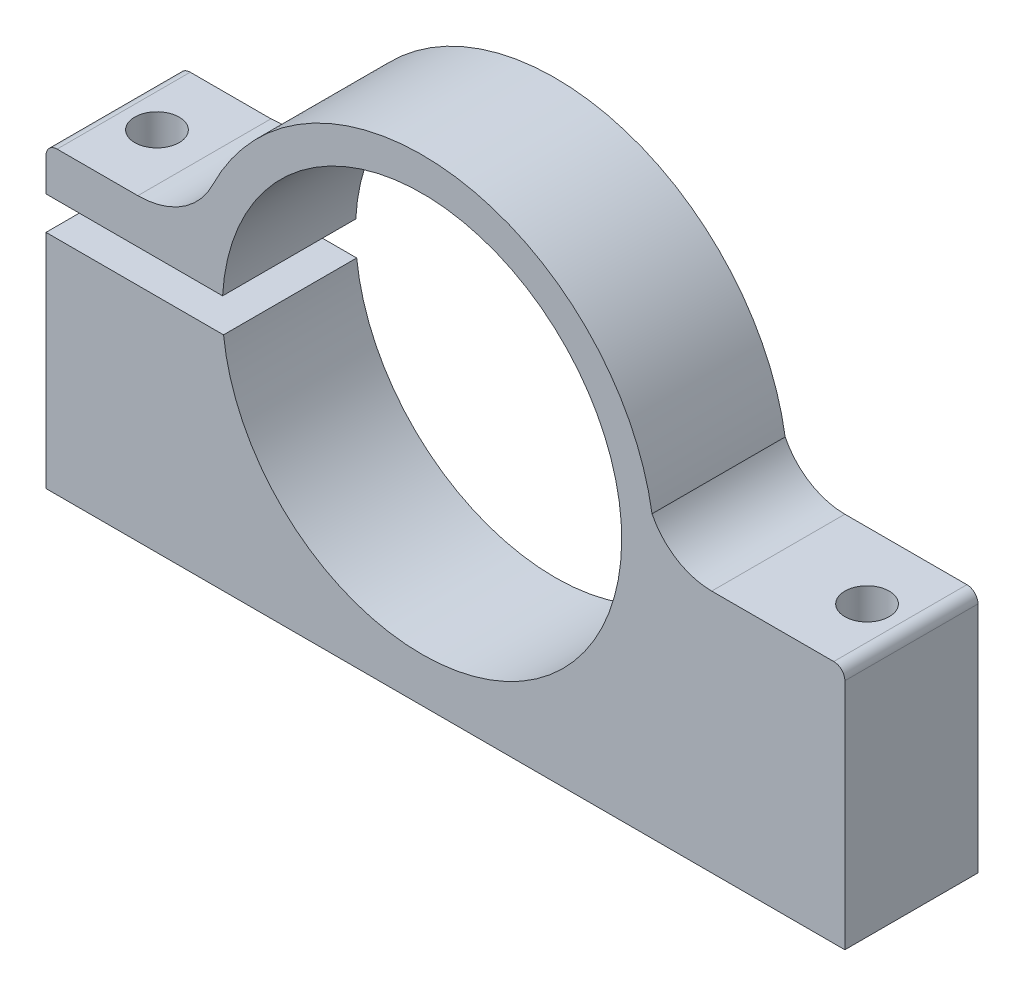
ISO-10303-21;
HEADER;
FILE_DESCRIPTION(('STEP AP214'),'2;1');
FILE_NAME('part.step','',(''),(''),'','','');
FILE_SCHEMA(('AUTOMOTIVE_DESIGN { 1 0 10303 214 1 1 1 1 }'));
ENDSEC;
DATA;
#1=APPLICATION_CONTEXT('core data for automotive mechanical design processes');
#2=APPLICATION_PROTOCOL_DEFINITION('international standard','automotive_design',2000,#1);
#3=PRODUCT_CONTEXT('',#1,'mechanical');
#4=PRODUCT('Part','Part','',(#3));
#5=PRODUCT_RELATED_PRODUCT_CATEGORY('part','',(#4));
#6=PRODUCT_DEFINITION_FORMATION('','',#4);
#7=PRODUCT_DEFINITION_CONTEXT('part definition',#1,'design');
#8=PRODUCT_DEFINITION('design','',#6,#7);
#9=PRODUCT_DEFINITION_SHAPE('','',#8);
#10=(LENGTH_UNIT() NAMED_UNIT(*) SI_UNIT(.MILLI.,.METRE.));
#11=(NAMED_UNIT(*) PLANE_ANGLE_UNIT() SI_UNIT($,.RADIAN.));
#12=(NAMED_UNIT(*) SI_UNIT($,.STERADIAN.) SOLID_ANGLE_UNIT());
#13=UNCERTAINTY_MEASURE_WITH_UNIT(LENGTH_MEASURE(1.E-05),#10,'distance_accuracy_value','');
#14=(GEOMETRIC_REPRESENTATION_CONTEXT(3) GLOBAL_UNCERTAINTY_ASSIGNED_CONTEXT((#13)) GLOBAL_UNIT_ASSIGNED_CONTEXT((#10,
#11,#12)) REPRESENTATION_CONTEXT('',''));
#15=CARTESIAN_POINT('',(0.,0.,0.));
#16=DIRECTION('',(0.,0.,1.));
#17=DIRECTION('',(1.,0.,0.));
#18=AXIS2_PLACEMENT_3D('',#15,#16,#17);
#19=CARTESIAN_POINT('',(0.,0.,-12.));
#20=DIRECTION('',(-1.,0.,0.));
#21=DIRECTION('',(0.,0.,-1.));
#22=AXIS2_PLACEMENT_3D('',#19,#20,#21);
#23=PLANE('',#22);
#24=DIRECTION('',(0.,1.,0.));
#25=VECTOR('',#24,1.);
#26=CARTESIAN_POINT('',(0.,0.,0.));
#27=LINE('',#26,#25);
#28=CARTESIAN_POINT('',(0.,0.,0.));
#29=VERTEX_POINT('',#28);
#30=CARTESIAN_POINT('',(0.,20.,0.));
#31=VERTEX_POINT('',#30);
#32=EDGE_CURVE('E156',#29,#31,#27,.T.);
#33=ORIENTED_EDGE('',*,*,#32,.T.);
#34=DIRECTION('',(0.,0.,1.));
#35=VECTOR('',#34,1.);
#36=CARTESIAN_POINT('',(0.,20.,-12.));
#37=LINE('',#36,#35);
#38=CARTESIAN_POINT('',(0.,20.,-12.));
#39=VERTEX_POINT('',#38);
#40=EDGE_CURVE('E138',#39,#31,#37,.T.);
#41=ORIENTED_EDGE('',*,*,#40,.F.);
#42=DIRECTION('',(0.,1.,0.));
#43=VECTOR('',#42,1.);
#44=CARTESIAN_POINT('',(0.,0.,-12.));
#45=LINE('',#44,#43);
#46=CARTESIAN_POINT('',(0.,0.,-12.));
#47=VERTEX_POINT('',#46);
#48=EDGE_CURVE('E144',#47,#39,#45,.T.);
#49=ORIENTED_EDGE('',*,*,#48,.F.);
#50=DIRECTION('',(0.,0.,1.));
#51=VECTOR('',#50,1.);
#52=CARTESIAN_POINT('',(0.,0.,-12.));
#53=LINE('',#52,#51);
#54=EDGE_CURVE('E177',#47,#29,#53,.T.);
#55=ORIENTED_EDGE('',*,*,#54,.T.);
#56=EDGE_LOOP('',(#33,#41,#49,#55));
#57=FACE_BOUND('',#56,.T.);
#58=ADVANCED_FACE('F35',(#57),#23,.T.);
#59=CARTESIAN_POINT('',(0.,0.,-12.));
#60=DIRECTION('',(0.,1.,0.));
#61=DIRECTION('',(0.,0.,-1.));
#62=AXIS2_PLACEMENT_3D('',#59,#60,#61);
#63=PLANE('',#62);
#64=CARTESIAN_POINT('',(68.,0.,-6.));
#65=DIRECTION('',(0.,1.,0.));
#66=DIRECTION('',(0.,0.,1.));
#67=AXIS2_PLACEMENT_3D('',#64,#65,#66);
#68=CIRCLE('',#67,2.);
#69=CARTESIAN_POINT('',(68.,0.,-4.));
#70=VERTEX_POINT('',#69);
#71=EDGE_CURVE('E172',#70,#70,#68,.T.);
#72=ORIENTED_EDGE('',*,*,#71,.T.);
#73=EDGE_LOOP('',(#72));
#74=FACE_BOUND('',#73,.T.);
#75=CARTESIAN_POINT('',(4.,0.,-6.));
#76=DIRECTION('',(0.,1.,0.));
#77=DIRECTION('',(0.,0.,1.));
#78=AXIS2_PLACEMENT_3D('',#75,#76,#77);
#79=CIRCLE('',#78,2.);
#80=CARTESIAN_POINT('',(4.,0.,-4.));
#81=VERTEX_POINT('',#80);
#82=EDGE_CURVE('E168',#81,#81,#79,.T.);
#83=ORIENTED_EDGE('',*,*,#82,.T.);
#84=EDGE_LOOP('',(#83));
#85=FACE_BOUND('',#84,.T.);
#86=DIRECTION('',(1.,0.,0.));
#87=VECTOR('',#86,1.);
#88=CARTESIAN_POINT('',(0.,0.,0.));
#89=LINE('',#88,#87);
#90=CARTESIAN_POINT('',(72.,0.,0.));
#91=VERTEX_POINT('',#90);
#92=EDGE_CURVE('E153',#29,#91,#89,.T.);
#93=ORIENTED_EDGE('',*,*,#92,.F.);
#94=ORIENTED_EDGE('',*,*,#54,.F.);
#95=DIRECTION('',(1.,0.,0.));
#96=VECTOR('',#95,1.);
#97=CARTESIAN_POINT('',(0.,0.,-12.));
#98=LINE('',#97,#96);
#99=CARTESIAN_POINT('',(72.,0.,-12.));
#100=VERTEX_POINT('',#99);
#101=EDGE_CURVE('E149',#47,#100,#98,.T.);
#102=ORIENTED_EDGE('',*,*,#101,.T.);
#103=DIRECTION('',(0.,0.,1.));
#104=VECTOR('',#103,1.);
#105=CARTESIAN_POINT('',(72.,0.,-12.));
#106=LINE('',#105,#104);
#107=EDGE_CURVE('E210',#100,#91,#106,.T.);
#108=ORIENTED_EDGE('',*,*,#107,.T.);
#109=EDGE_LOOP('',(#93,#94,#102,#108));
#110=FACE_BOUND('',#109,.T.);
#111=ADVANCED_FACE('F306',(#74,#85,#110),#63,.F.);
#112=CARTESIAN_POINT('',(72.,0.,-12.));
#113=DIRECTION('',(-1.,0.,0.));
#114=DIRECTION('',(0.,0.,-1.));
#115=AXIS2_PLACEMENT_3D('',#112,#113,#114);
#116=PLANE('',#115);
#117=DIRECTION('',(0.,1.,0.));
#118=VECTOR('',#117,1.);
#119=CARTESIAN_POINT('',(72.,0.,0.));
#120=LINE('',#119,#118);
#121=CARTESIAN_POINT('',(72.,21.,0.));
#122=VERTEX_POINT('',#121);
#123=EDGE_CURVE('E198',#91,#122,#120,.T.);
#124=ORIENTED_EDGE('',*,*,#123,.F.);
#125=ORIENTED_EDGE('',*,*,#107,.F.);
#126=DIRECTION('',(0.,1.,0.));
#127=VECTOR('',#126,1.);
#128=CARTESIAN_POINT('',(72.,0.,-12.));
#129=LINE('',#128,#127);
#130=CARTESIAN_POINT('',(72.,21.,-12.));
#131=VERTEX_POINT('',#130);
#132=EDGE_CURVE('E160',#100,#131,#129,.T.);
#133=ORIENTED_EDGE('',*,*,#132,.T.);
#134=DIRECTION('',(0.,0.,1.));
#135=VECTOR('',#134,1.);
#136=CARTESIAN_POINT('',(72.,21.,-12.));
#137=LINE('',#136,#135);
#138=EDGE_CURVE('E11',#122,#131,#137,.F.);
#139=ORIENTED_EDGE('',*,*,#138,.F.);
#140=EDGE_LOOP('',(#124,#125,#133,#139));
#141=FACE_BOUND('',#140,.T.);
#142=ADVANCED_FACE('F311',(#141),#116,.F.);
#143=CARTESIAN_POINT('',(72.,22.,-12.));
#144=DIRECTION('',(0.,-1.,0.));
#145=DIRECTION('',(0.,0.,1.));
#146=AXIS2_PLACEMENT_3D('',#143,#144,#145);
#147=PLANE('',#146);
#148=CARTESIAN_POINT('',(68.,22.,-6.));
#149=DIRECTION('',(0.,1.,0.));
#150=DIRECTION('',(0.,0.,1.));
#151=AXIS2_PLACEMENT_3D('',#148,#149,#150);
#152=CIRCLE('',#151,2.);
#153=CARTESIAN_POINT('',(68.,22.,-4.));
#154=VERTEX_POINT('',#153);
#155=EDGE_CURVE('E169',#154,#154,#152,.T.);
#156=ORIENTED_EDGE('',*,*,#155,.F.);
#157=EDGE_LOOP('',(#156));
#158=FACE_BOUND('',#157,.T.);
#159=DIRECTION('',(-1.,0.,0.));
#160=VECTOR('',#159,1.);
#161=CARTESIAN_POINT('',(72.,22.,-12.));
#162=LINE('',#161,#160);
#163=CARTESIAN_POINT('',(71.,22.,-12.));
#164=VERTEX_POINT('',#163);
#165=CARTESIAN_POINT('',(60.,22.,-12.));
#166=VERTEX_POINT('',#165);
#167=EDGE_CURVE('E261',#164,#166,#162,.T.);
#168=ORIENTED_EDGE('',*,*,#167,.T.);
#169=DIRECTION('',(0.,0.,1.));
#170=VECTOR('',#169,1.);
#171=CARTESIAN_POINT('',(60.,22.,-12.));
#172=LINE('',#171,#170);
#173=CARTESIAN_POINT('',(60.,22.,0.));
#174=VERTEX_POINT('',#173);
#175=EDGE_CURVE('E195',#166,#174,#172,.T.);
#176=ORIENTED_EDGE('',*,*,#175,.T.);
#177=DIRECTION('',(-1.,0.,0.));
#178=VECTOR('',#177,1.);
#179=CARTESIAN_POINT('',(72.,22.,0.));
#180=LINE('',#179,#178);
#181=CARTESIAN_POINT('',(71.,22.,0.));
#182=VERTEX_POINT('',#181);
#183=EDGE_CURVE('E192',#182,#174,#180,.T.);
#184=ORIENTED_EDGE('',*,*,#183,.F.);
#185=DIRECTION('',(0.,0.,1.));
#186=VECTOR('',#185,1.);
#187=CARTESIAN_POINT('',(71.,22.,-12.));
#188=LINE('',#187,#186);
#189=EDGE_CURVE('E43',#164,#182,#188,.T.);
#190=ORIENTED_EDGE('',*,*,#189,.F.);
#191=EDGE_LOOP('',(#168,#176,#184,#190));
#192=FACE_BOUND('',#191,.T.);
#193=ADVANCED_FACE('F193',(#158,#192),#147,.F.);
#194=CARTESIAN_POINT('',(60.,28.,-12.));
#195=DIRECTION('',(0.,0.,1.));
#196=DIRECTION('',(-1.,0.,0.));
#197=AXIS2_PLACEMENT_3D('',#194,#195,#196);
#198=CYLINDRICAL_SURFACE('',#197,6.);
#199=CARTESIAN_POINT('',(60.,28.,0.));
#200=DIRECTION('',(0.,0.,-1.));
#201=DIRECTION('',(-1.,0.,0.));
#202=AXIS2_PLACEMENT_3D('',#199,#200,#201);
#203=CIRCLE('',#202,6.);
#204=CARTESIAN_POINT('',(54.6209302283055,25.3418787854496,0.));
#205=VERTEX_POINT('',#204);
#206=EDGE_CURVE('E199',#174,#205,#203,.T.);
#207=ORIENTED_EDGE('',*,*,#206,.F.);
#208=ORIENTED_EDGE('',*,*,#175,.F.);
#209=CARTESIAN_POINT('',(60.,28.,-12.));
#210=DIRECTION('',(0.,0.,-1.));
#211=DIRECTION('',(-1.,0.,0.));
#212=AXIS2_PLACEMENT_3D('',#209,#210,#211);
#213=CIRCLE('',#212,6.);
#214=CARTESIAN_POINT('',(54.6209302283055,25.3418787854496,-12.));
#215=VERTEX_POINT('',#214);
#216=EDGE_CURVE('E260',#166,#215,#213,.T.);
#217=ORIENTED_EDGE('',*,*,#216,.T.);
#218=DIRECTION('',(0.,0.,1.));
#219=VECTOR('',#218,1.);
#220=CARTESIAN_POINT('',(54.6209302283055,25.3418787854496,-12.));
#221=LINE('',#220,#219);
#222=EDGE_CURVE('E214',#215,#205,#221,.T.);
#223=ORIENTED_EDGE('',*,*,#222,.T.);
#224=EDGE_LOOP('',(#207,#208,#217,#223));
#225=FACE_BOUND('',#224,.T.);
#226=ADVANCED_FACE('F259',(#225),#198,.F.);
#227=CARTESIAN_POINT('',(33.8885438199983,22.,-12.));
#228=DIRECTION('',(0.,0.,1.));
#229=DIRECTION('',(-1.,0.,0.));
#230=AXIS2_PLACEMENT_3D('',#227,#228,#229);
#231=CYLINDRICAL_SURFACE('',#230,21.);
#232=CARTESIAN_POINT('',(33.8885438199983,22.,0.));
#233=DIRECTION('',(0.,0.,-1.));
#234=DIRECTION('',(-1.,0.,0.));
#235=AXIS2_PLACEMENT_3D('',#232,#233,#234);
#236=CIRCLE('',#235,21.);
#237=CARTESIAN_POINT('',(15.016177646512,31.2105263157895,0.));
#238=VERTEX_POINT('',#237);
#239=EDGE_CURVE('E203',#238,#205,#236,.T.);
#240=ORIENTED_EDGE('',*,*,#239,.T.);
#241=ORIENTED_EDGE('',*,*,#222,.F.);
#242=CARTESIAN_POINT('',(33.8885438199983,22.,-12.));
#243=DIRECTION('',(0.,0.,-1.));
#244=DIRECTION('',(-1.,0.,0.));
#245=AXIS2_PLACEMENT_3D('',#242,#243,#244);
#246=CIRCLE('',#245,21.);
#247=CARTESIAN_POINT('',(15.016177646512,31.2105263157895,-12.));
#248=VERTEX_POINT('',#247);
#249=EDGE_CURVE('E262',#248,#215,#246,.T.);
#250=ORIENTED_EDGE('',*,*,#249,.F.);
#251=DIRECTION('',(0.,0.,1.));
#252=VECTOR('',#251,1.);
#253=CARTESIAN_POINT('',(15.016177646512,31.2105263157895,-12.));
#254=LINE('',#253,#252);
#255=EDGE_CURVE('E217',#248,#238,#254,.T.);
#256=ORIENTED_EDGE('',*,*,#255,.T.);
#257=EDGE_LOOP('',(#240,#241,#250,#256));
#258=FACE_BOUND('',#257,.T.);
#259=ADVANCED_FACE('F253',(#258),#231,.T.);
#260=CARTESIAN_POINT('',(8.27604687026692,34.5,-12.));
#261=DIRECTION('',(0.,0.,1.));
#262=DIRECTION('',(-1.,0.,0.));
#263=AXIS2_PLACEMENT_3D('',#260,#261,#262);
#264=CYLINDRICAL_SURFACE('',#263,7.5);
#265=CARTESIAN_POINT('',(8.27604687026692,34.5,0.));
#266=DIRECTION('',(0.,0.,1.));
#267=DIRECTION('',(1.,0.,0.));
#268=AXIS2_PLACEMENT_3D('',#265,#266,#267);
#269=CIRCLE('',#268,7.5);
#270=CARTESIAN_POINT('',(8.27604687026692,27.,0.));
#271=VERTEX_POINT('',#270);
#272=EDGE_CURVE('E249',#271,#238,#269,.T.);
#273=ORIENTED_EDGE('',*,*,#272,.T.);
#274=ORIENTED_EDGE('',*,*,#255,.F.);
#275=CARTESIAN_POINT('',(8.27604687026692,34.5,-12.));
#276=DIRECTION('',(0.,0.,1.));
#277=DIRECTION('',(1.,0.,0.));
#278=AXIS2_PLACEMENT_3D('',#275,#276,#277);
#279=CIRCLE('',#278,7.5);
#280=CARTESIAN_POINT('',(8.27604687026692,27.,-12.));
#281=VERTEX_POINT('',#280);
#282=EDGE_CURVE('E265',#281,#248,#279,.T.);
#283=ORIENTED_EDGE('',*,*,#282,.F.);
#284=DIRECTION('',(0.,0.,1.));
#285=VECTOR('',#284,1.);
#286=CARTESIAN_POINT('',(8.27604687026692,27.,-12.));
#287=LINE('',#286,#285);
#288=EDGE_CURVE('E220',#281,#271,#287,.T.);
#289=ORIENTED_EDGE('',*,*,#288,.T.);
#290=EDGE_LOOP('',(#273,#274,#283,#289));
#291=FACE_BOUND('',#290,.T.);
#292=ADVANCED_FACE('F284',(#291),#264,.F.);
#293=CARTESIAN_POINT('',(0.,27.,-12.));
#294=DIRECTION('',(0.,1.,0.));
#295=DIRECTION('',(0.,0.,-1.));
#296=AXIS2_PLACEMENT_3D('',#293,#294,#295);
#297=PLANE('',#296);
#298=CARTESIAN_POINT('',(4.,27.,-6.));
#299=DIRECTION('',(0.,-1.,0.));
#300=DIRECTION('',(0.,0.,-1.));
#301=AXIS2_PLACEMENT_3D('',#298,#299,#300);
#302=CIRCLE('',#301,2.);
#303=CARTESIAN_POINT('',(4.,27.,-8.));
#304=VERTEX_POINT('',#303);
#305=EDGE_CURVE('E271',#304,#304,#302,.T.);
#306=ORIENTED_EDGE('',*,*,#305,.T.);
#307=EDGE_LOOP('',(#306));
#308=FACE_BOUND('',#307,.T.);
#309=DIRECTION('',(1.,0.,0.));
#310=VECTOR('',#309,1.);
#311=CARTESIAN_POINT('',(0.,27.,0.));
#312=LINE('',#311,#310);
#313=CARTESIAN_POINT('',(1.,27.,0.));
#314=VERTEX_POINT('',#313);
#315=EDGE_CURVE('E242',#314,#271,#312,.T.);
#316=ORIENTED_EDGE('',*,*,#315,.T.);
#317=ORIENTED_EDGE('',*,*,#288,.F.);
#318=DIRECTION('',(1.,0.,0.));
#319=VECTOR('',#318,1.);
#320=CARTESIAN_POINT('',(0.,27.,-12.));
#321=LINE('',#320,#319);
#322=CARTESIAN_POINT('',(1.,27.,-12.));
#323=VERTEX_POINT('',#322);
#324=EDGE_CURVE('E279',#323,#281,#321,.T.);
#325=ORIENTED_EDGE('',*,*,#324,.F.);
#326=DIRECTION('',(0.,0.,1.));
#327=VECTOR('',#326,1.);
#328=CARTESIAN_POINT('',(1.,27.,-12.));
#329=LINE('',#328,#327);
#330=EDGE_CURVE('E181',#314,#323,#329,.F.);
#331=ORIENTED_EDGE('',*,*,#330,.F.);
#332=EDGE_LOOP('',(#316,#317,#325,#331));
#333=FACE_BOUND('',#332,.T.);
#334=ADVANCED_FACE('F288',(#308,#333),#297,.T.);
#335=CARTESIAN_POINT('',(0.,23.,-12.));
#336=DIRECTION('',(-1.,0.,0.));
#337=DIRECTION('',(0.,-1.,0.));
#338=AXIS2_PLACEMENT_3D('',#335,#336,#337);
#339=PLANE('',#338);
#340=DIRECTION('',(0.,1.,0.));
#341=VECTOR('',#340,1.);
#342=CARTESIAN_POINT('',(0.,23.,-12.));
#343=LINE('',#342,#341);
#344=CARTESIAN_POINT('',(0.,23.,-12.));
#345=VERTEX_POINT('',#344);
#346=CARTESIAN_POINT('',(0.,26.,-12.));
#347=VERTEX_POINT('',#346);
#348=EDGE_CURVE('E274',#345,#347,#343,.T.);
#349=ORIENTED_EDGE('',*,*,#348,.F.);
#350=DIRECTION('',(0.,0.,1.));
#351=VECTOR('',#350,1.);
#352=CARTESIAN_POINT('',(0.,23.,-12.));
#353=LINE('',#352,#351);
#354=CARTESIAN_POINT('',(0.,23.,0.));
#355=VERTEX_POINT('',#354);
#356=EDGE_CURVE('E223',#345,#355,#353,.T.);
#357=ORIENTED_EDGE('',*,*,#356,.T.);
#358=DIRECTION('',(0.,1.,0.));
#359=VECTOR('',#358,1.);
#360=CARTESIAN_POINT('',(0.,23.,0.));
#361=LINE('',#360,#359);
#362=CARTESIAN_POINT('',(0.,26.,0.));
#363=VERTEX_POINT('',#362);
#364=EDGE_CURVE('E240',#355,#363,#361,.T.);
#365=ORIENTED_EDGE('',*,*,#364,.T.);
#366=DIRECTION('',(0.,0.,1.));
#367=VECTOR('',#366,1.);
#368=CARTESIAN_POINT('',(0.,26.,-12.));
#369=LINE('',#368,#367);
#370=EDGE_CURVE('E173',#347,#363,#369,.T.);
#371=ORIENTED_EDGE('',*,*,#370,.F.);
#372=EDGE_LOOP('',(#349,#357,#365,#371));
#373=FACE_BOUND('',#372,.T.);
#374=ADVANCED_FACE('F294',(#373),#339,.T.);
#375=CARTESIAN_POINT('',(15.9163430643869,23.,-12.));
#376=DIRECTION('',(0.,-1.,0.));
#377=DIRECTION('',(1.,0.,0.));
#378=AXIS2_PLACEMENT_3D('',#375,#376,#377);
#379=PLANE('',#378);
#380=CARTESIAN_POINT('',(4.,23.,-6.));
#381=DIRECTION('',(0.,1.,0.));
#382=DIRECTION('',(1.,0.,0.));
#383=AXIS2_PLACEMENT_3D('',#380,#381,#382);
#384=CIRCLE('',#383,2.);
#385=CARTESIAN_POINT('',(6.,23.,-6.));
#386=VERTEX_POINT('',#385);
#387=EDGE_CURVE('E167',#386,#386,#384,.T.);
#388=ORIENTED_EDGE('',*,*,#387,.T.);
#389=EDGE_LOOP('',(#388));
#390=FACE_BOUND('',#389,.T.);
#391=DIRECTION('',(-1.,0.,0.));
#392=VECTOR('',#391,1.);
#393=CARTESIAN_POINT('',(15.9163430643869,23.,0.));
#394=LINE('',#393,#392);
#395=CARTESIAN_POINT('',(15.9163430643869,23.,0.));
#396=VERTEX_POINT('',#395);
#397=EDGE_CURVE('E232',#396,#355,#394,.T.);
#398=ORIENTED_EDGE('',*,*,#397,.T.);
#399=ORIENTED_EDGE('',*,*,#356,.F.);
#400=DIRECTION('',(-1.,0.,0.));
#401=VECTOR('',#400,1.);
#402=CARTESIAN_POINT('',(15.9163430643869,23.,-12.));
#403=LINE('',#402,#401);
#404=CARTESIAN_POINT('',(15.9163430643869,23.,-12.));
#405=VERTEX_POINT('',#404);
#406=EDGE_CURVE('E234',#405,#345,#403,.T.);
#407=ORIENTED_EDGE('',*,*,#406,.F.);
#408=DIRECTION('',(0.,0.,1.));
#409=VECTOR('',#408,1.);
#410=CARTESIAN_POINT('',(15.9163430643869,23.,-12.));
#411=LINE('',#410,#409);
#412=EDGE_CURVE('E158',#405,#396,#411,.T.);
#413=ORIENTED_EDGE('',*,*,#412,.T.);
#414=EDGE_LOOP('',(#398,#399,#407,#413));
#415=FACE_BOUND('',#414,.T.);
#416=ADVANCED_FACE('F230',(#390,#415),#379,.T.);
#417=CARTESIAN_POINT('',(33.8885438199983,22.,-12.));
#418=DIRECTION('',(0.,0.,1.));
#419=DIRECTION('',(-1.,0.,0.));
#420=AXIS2_PLACEMENT_3D('',#417,#418,#419);
#421=CYLINDRICAL_SURFACE('',#420,18.);
#422=CARTESIAN_POINT('',(33.8885438199983,22.,0.));
#423=DIRECTION('',(0.,0.,1.));
#424=DIRECTION('',(1.,0.,0.));
#425=AXIS2_PLACEMENT_3D('',#422,#423,#424);
#426=CIRCLE('',#425,18.);
#427=CARTESIAN_POINT('',(16.,20.,0.));
#428=VERTEX_POINT('',#427);
#429=EDGE_CURVE('E238',#428,#396,#426,.T.);
#430=ORIENTED_EDGE('',*,*,#429,.T.);
#431=ORIENTED_EDGE('',*,*,#412,.F.);
#432=CARTESIAN_POINT('',(33.8885438199983,22.,-12.));
#433=DIRECTION('',(0.,0.,1.));
#434=DIRECTION('',(1.,0.,0.));
#435=AXIS2_PLACEMENT_3D('',#432,#433,#434);
#436=CIRCLE('',#435,18.);
#437=CARTESIAN_POINT('',(16.,20.,-12.));
#438=VERTEX_POINT('',#437);
#439=EDGE_CURVE('E143',#438,#405,#436,.T.);
#440=ORIENTED_EDGE('',*,*,#439,.F.);
#441=DIRECTION('',(0.,0.,1.));
#442=VECTOR('',#441,1.);
#443=CARTESIAN_POINT('',(16.,20.,-12.));
#444=LINE('',#443,#442);
#445=EDGE_CURVE('E141',#438,#428,#444,.T.);
#446=ORIENTED_EDGE('',*,*,#445,.T.);
#447=EDGE_LOOP('',(#430,#431,#440,#446));
#448=FACE_BOUND('',#447,.T.);
#449=ADVANCED_FACE('F272',(#448),#421,.F.);
#450=CARTESIAN_POINT('',(0.,20.,-12.));
#451=DIRECTION('',(0.,1.,0.));
#452=DIRECTION('',(0.,0.,-1.));
#453=AXIS2_PLACEMENT_3D('',#450,#451,#452);
#454=PLANE('',#453);
#455=CARTESIAN_POINT('',(4.,20.,-6.));
#456=DIRECTION('',(0.,-1.,0.));
#457=DIRECTION('',(0.,0.,-1.));
#458=AXIS2_PLACEMENT_3D('',#455,#456,#457);
#459=CIRCLE('',#458,2.);
#460=CARTESIAN_POINT('',(4.,20.,-8.));
#461=VERTEX_POINT('',#460);
#462=EDGE_CURVE('E164',#461,#461,#459,.T.);
#463=ORIENTED_EDGE('',*,*,#462,.T.);
#464=EDGE_LOOP('',(#463));
#465=FACE_BOUND('',#464,.T.);
#466=DIRECTION('',(1.,0.,0.));
#467=VECTOR('',#466,1.);
#468=CARTESIAN_POINT('',(0.,20.,0.));
#469=LINE('',#468,#467);
#470=EDGE_CURVE('E244',#31,#428,#469,.T.);
#471=ORIENTED_EDGE('',*,*,#470,.T.);
#472=ORIENTED_EDGE('',*,*,#445,.F.);
#473=DIRECTION('',(1.,0.,0.));
#474=VECTOR('',#473,1.);
#475=CARTESIAN_POINT('',(0.,20.,-12.));
#476=LINE('',#475,#474);
#477=EDGE_CURVE('E134',#39,#438,#476,.T.);
#478=ORIENTED_EDGE('',*,*,#477,.F.);
#479=ORIENTED_EDGE('',*,*,#40,.T.);
#480=EDGE_LOOP('',(#471,#472,#478,#479));
#481=FACE_BOUND('',#480,.T.);
#482=ADVANCED_FACE('F136',(#465,#481),#454,.T.);
#483=CARTESIAN_POINT('',(33.8885438199983,22.,-12.));
#484=DIRECTION('',(0.,0.,-1.));
#485=DIRECTION('',(1.,0.,0.));
#486=AXIS2_PLACEMENT_3D('',#483,#484,#485);
#487=PLANE('',#486);
#488=ORIENTED_EDGE('',*,*,#324,.T.);
#489=ORIENTED_EDGE('',*,*,#282,.T.);
#490=ORIENTED_EDGE('',*,*,#249,.T.);
#491=ORIENTED_EDGE('',*,*,#216,.F.);
#492=ORIENTED_EDGE('',*,*,#167,.F.);
#493=CARTESIAN_POINT('',(71.,21.,-12.));
#494=DIRECTION('',(0.,0.,1.));
#495=DIRECTION('',(1.,0.,0.));
#496=AXIS2_PLACEMENT_3D('',#493,#494,#495);
#497=CIRCLE('',#496,1.);
#498=EDGE_CURVE('E49',#131,#164,#497,.T.);
#499=ORIENTED_EDGE('',*,*,#498,.F.);
#500=ORIENTED_EDGE('',*,*,#132,.F.);
#501=ORIENTED_EDGE('',*,*,#101,.F.);
#502=ORIENTED_EDGE('',*,*,#48,.T.);
#503=ORIENTED_EDGE('',*,*,#477,.T.);
#504=ORIENTED_EDGE('',*,*,#439,.T.);
#505=ORIENTED_EDGE('',*,*,#406,.T.);
#506=ORIENTED_EDGE('',*,*,#348,.T.);
#507=CARTESIAN_POINT('',(1.,26.,-12.));
#508=DIRECTION('',(0.,0.,1.));
#509=DIRECTION('',(1.,0.,0.));
#510=AXIS2_PLACEMENT_3D('',#507,#508,#509);
#511=CIRCLE('',#510,1.);
#512=EDGE_CURVE('E185',#323,#347,#511,.T.);
#513=ORIENTED_EDGE('',*,*,#512,.F.);
#514=EDGE_LOOP('',(#488,#489,#490,#491,#492,#499,#500,#501,#502,#503,#504,#505,#506,#513));
#515=FACE_BOUND('',#514,.T.);
#516=ADVANCED_FACE('F147',(#515),#487,.T.);
#517=CARTESIAN_POINT('',(33.8885438199983,22.,0.));
#518=DIRECTION('',(0.,0.,-1.));
#519=DIRECTION('',(1.,0.,0.));
#520=AXIS2_PLACEMENT_3D('',#517,#518,#519);
#521=PLANE('',#520);
#522=ORIENTED_EDGE('',*,*,#364,.F.);
#523=ORIENTED_EDGE('',*,*,#397,.F.);
#524=ORIENTED_EDGE('',*,*,#429,.F.);
#525=ORIENTED_EDGE('',*,*,#470,.F.);
#526=ORIENTED_EDGE('',*,*,#32,.F.);
#527=ORIENTED_EDGE('',*,*,#92,.T.);
#528=ORIENTED_EDGE('',*,*,#123,.T.);
#529=CARTESIAN_POINT('',(71.,21.,0.));
#530=DIRECTION('',(0.,0.,1.));
#531=DIRECTION('',(1.,0.,0.));
#532=AXIS2_PLACEMENT_3D('',#529,#530,#531);
#533=CIRCLE('',#532,1.);
#534=EDGE_CURVE('E176',#182,#122,#533,.F.);
#535=ORIENTED_EDGE('',*,*,#534,.F.);
#536=ORIENTED_EDGE('',*,*,#183,.T.);
#537=ORIENTED_EDGE('',*,*,#206,.T.);
#538=ORIENTED_EDGE('',*,*,#239,.F.);
#539=ORIENTED_EDGE('',*,*,#272,.F.);
#540=ORIENTED_EDGE('',*,*,#315,.F.);
#541=CARTESIAN_POINT('',(1.,26.,0.));
#542=DIRECTION('',(0.,0.,1.));
#543=DIRECTION('',(1.,0.,0.));
#544=AXIS2_PLACEMENT_3D('',#541,#542,#543);
#545=CIRCLE('',#544,1.);
#546=EDGE_CURVE('E179',#363,#314,#545,.F.);
#547=ORIENTED_EDGE('',*,*,#546,.F.);
#548=EDGE_LOOP('',(#522,#523,#524,#525,#526,#527,#528,#535,#536,#537,#538,#539,#540,#547));
#549=FACE_BOUND('',#548,.T.);
#550=ADVANCED_FACE('F237',(#549),#521,.F.);
#551=CARTESIAN_POINT('',(4.,43.,-6.));
#552=DIRECTION('',(0.,-1.,0.));
#553=DIRECTION('',(0.,0.,1.));
#554=AXIS2_PLACEMENT_3D('',#551,#552,#553);
#555=CYLINDRICAL_SURFACE('',#554,2.);
#556=ORIENTED_EDGE('',*,*,#462,.F.);
#557=EDGE_LOOP('',(#556));
#558=FACE_BOUND('',#557,.T.);
#559=ORIENTED_EDGE('',*,*,#82,.F.);
#560=EDGE_LOOP('',(#559));
#561=FACE_BOUND('',#560,.T.);
#562=ADVANCED_FACE('F328',(#558,#561),#555,.F.);
#563=ORIENTED_EDGE('',*,*,#305,.F.);
#564=EDGE_LOOP('',(#563));
#565=FACE_BOUND('',#564,.T.);
#566=ORIENTED_EDGE('',*,*,#387,.F.);
#567=EDGE_LOOP('',(#566));
#568=FACE_BOUND('',#567,.T.);
#569=ADVANCED_FACE('F322',(#565,#568),#555,.F.);
#570=CARTESIAN_POINT('',(68.,32.,-6.));
#571=DIRECTION('',(0.,-1.,0.));
#572=DIRECTION('',(0.,0.,1.));
#573=AXIS2_PLACEMENT_3D('',#570,#571,#572);
#574=CYLINDRICAL_SURFACE('',#573,2.);
#575=ORIENTED_EDGE('',*,*,#71,.F.);
#576=EDGE_LOOP('',(#575));
#577=FACE_BOUND('',#576,.T.);
#578=ORIENTED_EDGE('',*,*,#155,.T.);
#579=EDGE_LOOP('',(#578));
#580=FACE_BOUND('',#579,.T.);
#581=ADVANCED_FACE('F317',(#577,#580),#574,.F.);
#582=CARTESIAN_POINT('',(1.,26.,-12.));
#583=DIRECTION('',(0.,0.,1.));
#584=DIRECTION('',(-1.,0.,0.));
#585=AXIS2_PLACEMENT_3D('',#582,#583,#584);
#586=CYLINDRICAL_SURFACE('',#585,1.);
#587=ORIENTED_EDGE('',*,*,#512,.T.);
#588=ORIENTED_EDGE('',*,*,#370,.T.);
#589=ORIENTED_EDGE('',*,*,#546,.T.);
#590=ORIENTED_EDGE('',*,*,#330,.T.);
#591=EDGE_LOOP('',(#587,#588,#589,#590));
#592=FACE_BOUND('',#591,.T.);
#593=ADVANCED_FACE('F290',(#592),#586,.T.);
#594=CARTESIAN_POINT('',(71.,21.,-12.));
#595=DIRECTION('',(0.,0.,1.));
#596=DIRECTION('',(-1.,0.,0.));
#597=AXIS2_PLACEMENT_3D('',#594,#595,#596);
#598=CYLINDRICAL_SURFACE('',#597,1.);
#599=ORIENTED_EDGE('',*,*,#498,.T.);
#600=ORIENTED_EDGE('',*,*,#189,.T.);
#601=ORIENTED_EDGE('',*,*,#534,.T.);
#602=ORIENTED_EDGE('',*,*,#138,.T.);
#603=EDGE_LOOP('',(#599,#600,#601,#602));
#604=FACE_BOUND('',#603,.T.);
#605=ADVANCED_FACE('F37',(#604),#598,.T.);
#606=CLOSED_SHELL('',(#58,#111,#142,#193,#226,#259,#292,#334,#374,#416,#449,#482,#516,#550,#562,
#569,#581,#593,#605));
#607=MANIFOLD_SOLID_BREP('B2',#606);
#608=ADVANCED_BREP_SHAPE_REPRESENTATION('',(#18,#607),#14);
#609=SHAPE_DEFINITION_REPRESENTATION(#9,#608);
ENDSEC;
END-ISO-10303-21;
